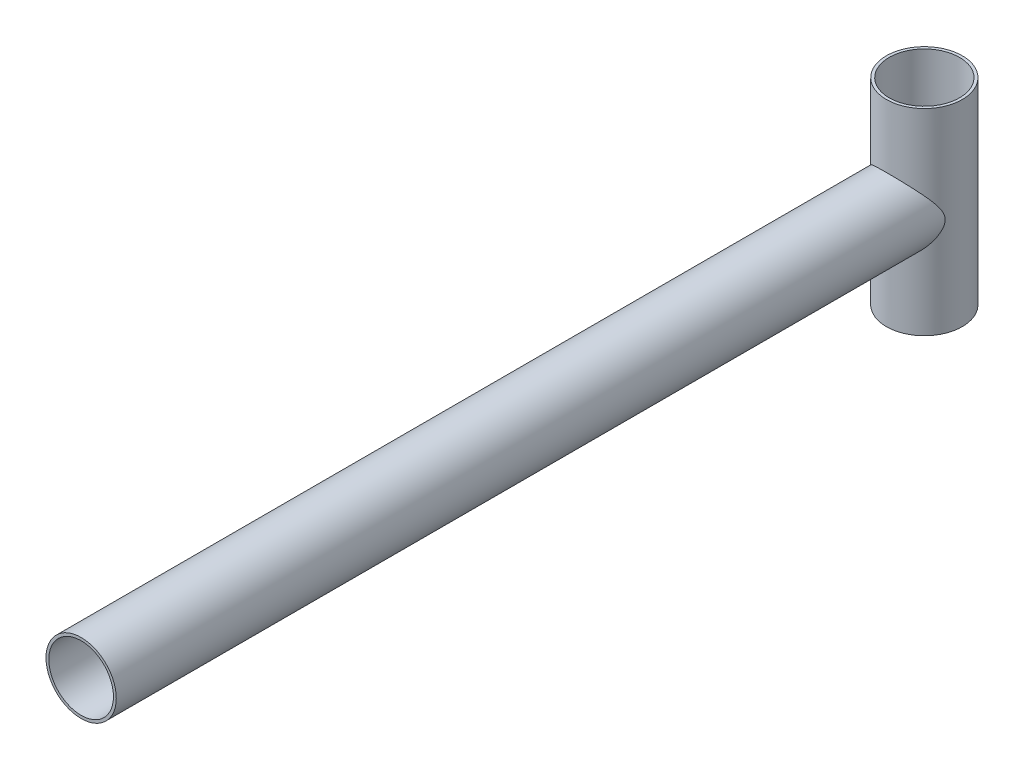
ISO-10303-21;
HEADER;
FILE_DESCRIPTION(('STEP AP214'),'2;1');
FILE_NAME('part.step','',(''),(''),'','','');
FILE_SCHEMA(('AUTOMOTIVE_DESIGN { 1 0 10303 214 1 1 1 1 }'));
ENDSEC;
DATA;
#1=APPLICATION_CONTEXT('core data for automotive mechanical design processes');
#2=APPLICATION_PROTOCOL_DEFINITION('international standard','automotive_design',2000,#1);
#3=PRODUCT_CONTEXT('',#1,'mechanical');
#4=PRODUCT('Part','Part','',(#3));
#5=PRODUCT_RELATED_PRODUCT_CATEGORY('part','',(#4));
#6=PRODUCT_DEFINITION_FORMATION('','',#4);
#7=PRODUCT_DEFINITION_CONTEXT('part definition',#1,'design');
#8=PRODUCT_DEFINITION('design','',#6,#7);
#9=PRODUCT_DEFINITION_SHAPE('','',#8);
#10=(LENGTH_UNIT() NAMED_UNIT(*) SI_UNIT(.MILLI.,.METRE.));
#11=(NAMED_UNIT(*) PLANE_ANGLE_UNIT() SI_UNIT($,.RADIAN.));
#12=(NAMED_UNIT(*) SI_UNIT($,.STERADIAN.) SOLID_ANGLE_UNIT());
#13=UNCERTAINTY_MEASURE_WITH_UNIT(LENGTH_MEASURE(1.E-05),#10,'distance_accuracy_value','');
#14=(GEOMETRIC_REPRESENTATION_CONTEXT(3) GLOBAL_UNCERTAINTY_ASSIGNED_CONTEXT((#13)) GLOBAL_UNIT_ASSIGNED_CONTEXT((#10,
#11,#12)) REPRESENTATION_CONTEXT('',''));
#15=CARTESIAN_POINT('',(0.,0.,0.));
#16=DIRECTION('',(0.,0.,1.));
#17=DIRECTION('',(1.,0.,0.));
#18=AXIS2_PLACEMENT_3D('',#15,#16,#17);
#19=CARTESIAN_POINT('',(0.,35.,0.));
#20=DIRECTION('',(0.,-1.,0.));
#21=DIRECTION('',(0.,0.,-1.));
#22=AXIS2_PLACEMENT_3D('',#19,#20,#21);
#23=CYLINDRICAL_SURFACE('',#22,13.5);
#24=CARTESIAN_POINT('',(0.,35.,0.));
#25=DIRECTION('',(0.,1.,0.));
#26=DIRECTION('',(0.,0.,1.));
#27=AXIS2_PLACEMENT_3D('',#24,#25,#26);
#28=CIRCLE('',#27,13.5);
#29=CARTESIAN_POINT('',(0.,35.,13.5));
#30=VERTEX_POINT('',#29);
#31=EDGE_CURVE('E41',#30,#30,#28,.T.);
#32=ORIENTED_EDGE('',*,*,#31,.F.);
#33=EDGE_LOOP('',(#32));
#34=FACE_BOUND('',#33,.T.);
#35=CARTESIAN_POINT('',(0.,-35.,0.));
#36=DIRECTION('',(0.,1.,0.));
#37=DIRECTION('',(0.,0.,1.));
#38=AXIS2_PLACEMENT_3D('',#35,#36,#37);
#39=CIRCLE('',#38,13.5);
#40=CARTESIAN_POINT('',(0.,-35.,13.5));
#41=VERTEX_POINT('',#40);
#42=EDGE_CURVE('E45',#41,#41,#39,.T.);
#43=ORIENTED_EDGE('',*,*,#42,.T.);
#44=EDGE_LOOP('',(#43));
#45=FACE_BOUND('',#44,.T.);
#46=CARTESIAN_POINT('',(-12.5,0.,5.09901951359278));
#47=CARTESIAN_POINT('',(-12.4999980153661,-0.171195739511042,5.09902766777696));
#48=CARTESIAN_POINT('',(-12.4964677234357,-0.342475989978951,5.10770534306377));
#49=CARTESIAN_POINT('',(-12.482484900301,-0.683158412139467,5.14177882846587));
#50=CARTESIAN_POINT('',(-12.4720258298574,-0.852558655811287,5.16719043158399));
#51=CARTESIAN_POINT('',(-12.444511336363,-1.18856266162003,5.23310646501161));
#52=CARTESIAN_POINT('',(-12.4274278439932,-1.35515133305615,5.27367509232845));
#53=CARTESIAN_POINT('',(-12.38715952836,-1.68396919389914,5.36757735075688));
#54=CARTESIAN_POINT('',(-12.3639709667379,-1.84619564484517,5.42091880132123));
#55=CARTESIAN_POINT('',(-12.2982817050272,-2.25021778657923,5.56882154382599));
#56=CARTESIAN_POINT('',(-12.2520449498664,-2.48886821588845,5.67028740549554));
#57=CARTESIAN_POINT('',(-12.1479085024809,-2.95560344340862,5.89008765559115));
#58=CARTESIAN_POINT('',(-12.0899994640286,-3.18367959342151,6.00843553944686));
#59=CARTESIAN_POINT('',(-11.9632716169582,-3.63102147577967,6.25696908355778));
#60=CARTESIAN_POINT('',(-11.8944202078475,-3.85025834567505,6.38718960529778));
#61=CARTESIAN_POINT('',(-11.7465133364499,-4.28031735092628,6.65528949755655));
#62=CARTESIAN_POINT('',(-11.6674599682605,-4.49114120157924,6.7931672930113));
#63=CARTESIAN_POINT('',(-11.5044795772759,-4.89296233189367,7.06545141537953));
#64=CARTESIAN_POINT('',(-11.4211293232534,-5.08439033236111,7.19956989122054));
#65=CARTESIAN_POINT('',(-11.2457772424784,-5.46128872310491,7.4705135019963));
#66=CARTESIAN_POINT('',(-11.1537742126215,-5.64675828007975,7.60733901122932));
#67=CARTESIAN_POINT('',(-10.8647276159604,-6.19505406597116,8.01999653977496));
#68=CARTESIAN_POINT('',(-10.6547146029709,-6.54960058958076,8.2978935238081));
#69=CARTESIAN_POINT('',(-10.2001085210487,-7.23721750031258,8.85076100138681));
#70=CARTESIAN_POINT('',(-9.95555805668294,-7.57031362187798,9.12573465830994));
#71=CARTESIAN_POINT('',(-9.43089029150658,-8.21466723271007,9.66696659856982));
#72=CARTESIAN_POINT('',(-9.15079298860344,-8.52593684942058,9.93322967717262));
#73=CARTESIAN_POINT('',(-8.63097268102672,-9.04735783741291,10.3847212100218));
#74=CARTESIAN_POINT('',(-8.39942690645402,-9.26290723240262,10.573160412335));
#75=CARTESIAN_POINT('',(-7.91590597729258,-9.67937121800385,10.9398568770643));
#76=CARTESIAN_POINT('',(-7.66393095580943,-9.88028590395082,11.1181142058069));
#77=CARTESIAN_POINT('',(-7.13986466855235,-10.2653745551155,11.461691711848));
#78=CARTESIAN_POINT('',(-6.86780233348845,-10.4495717764494,11.627029815451));
#79=CARTESIAN_POINT('',(-6.3035306280357,-10.7993337964389,11.9423568554927));
#80=CARTESIAN_POINT('',(-6.01132585384088,-10.9649028232134,12.092349274302));
#81=CARTESIAN_POINT('',(-5.46924230106502,-11.2432342414448,12.3453505755766));
#82=CARTESIAN_POINT('',(-5.22290761505925,-11.3598753692854,12.4516986450795));
#83=CARTESIAN_POINT('',(-4.71870555755988,-11.5783967439471,12.6513754204859));
#84=CARTESIAN_POINT('',(-4.46084076996544,-11.6802802764677,12.7447070242633));
#85=CARTESIAN_POINT('',(-3.93465912034715,-11.8678742504716,12.916851416443));
#86=CARTESIAN_POINT('',(-3.66634548353044,-11.9535896355215,12.9956686425806));
#87=CARTESIAN_POINT('',(-3.12061254005726,-12.1075242369907,13.1373985479734));
#88=CARTESIAN_POINT('',(-2.84319313466375,-12.1757432636201,13.2003110547039));
#89=CARTESIAN_POINT('',(-2.27911534295112,-12.2938697224964,13.3093468015743));
#90=CARTESIAN_POINT('',(-1.99240589989755,-12.3436457120741,13.3553495086279));
#91=CARTESIAN_POINT('',(-1.41387044941108,-12.4232128176673,13.4289235155226));
#92=CARTESIAN_POINT('',(-1.12204442720692,-12.4530038759778,13.4564947621441));
#93=CARTESIAN_POINT('',(-0.535951444440154,-12.4919565317164,13.4925506708853));
#94=CARTESIAN_POINT('',(-0.241685462082728,-12.501126029865,13.5010426428298));
#95=CARTESIAN_POINT('',(0.346668381859068,-12.498653540959,13.4987532562118));
#96=CARTESIAN_POINT('',(0.640756256765499,-12.4870133731087,13.4879735823981));
#97=CARTESIAN_POINT('',(1.1935594563605,-12.4456225917525,13.4496643000956));
#98=CARTESIAN_POINT('',(1.45257961669995,-12.4180243138584,13.4241255089941));
#99=CARTESIAN_POINT('',(1.9665580164033,-12.3470619538639,13.3585087499393));
#100=CARTESIAN_POINT('',(2.22151661907957,-12.3036992902712,13.3184320901303));
#101=CARTESIAN_POINT('',(2.72580727384063,-12.2018916291037,13.2244386346563));
#102=CARTESIAN_POINT('',(2.97513892976353,-12.1434455731715,13.1705208678028));
#103=CARTESIAN_POINT('',(3.46681514949667,-12.0123244961524,13.0497237466566));
#104=CARTESIAN_POINT('',(3.70915930806055,-11.9396486516926,12.9828436423313));
#105=CARTESIAN_POINT('',(4.1950071563081,-11.7779449839743,12.834287227603));
#106=CARTESIAN_POINT('',(4.43819050543388,-11.6883918122719,12.752137238656));
#107=CARTESIAN_POINT('',(4.91496292006698,-11.4960538575987,12.5760786680992));
#108=CARTESIAN_POINT('',(5.14854824135467,-11.3932639743891,12.4821655544218));
#109=CARTESIAN_POINT('',(5.60536824074998,-11.1755924509715,12.2838046526183));
#110=CARTESIAN_POINT('',(5.82860264257494,-11.0607104882739,12.1793565835334));
#111=CARTESIAN_POINT('',(6.26430493722003,-10.8199107615154,11.9610988031811));
#112=CARTESIAN_POINT('',(6.47677051565773,-10.6939906409265,11.8472870931975));
#113=CARTESIAN_POINT('',(6.99924978663592,-10.3633921270673,11.5495601351507));
#114=CARTESIAN_POINT('',(7.30197422271688,-10.1520473397054,11.3601867482934));
#115=CARTESIAN_POINT('',(7.8814936497697,-9.7090277434718,10.9660826097507));
#116=CARTESIAN_POINT('',(8.15827693293423,-9.47734384560182,10.7613449982028));
#117=CARTESIAN_POINT('',(8.68672920978941,-8.99549483475712,10.339502584476));
#118=CARTESIAN_POINT('',(8.93833103934785,-8.74528323945787,10.1223670133622));
#119=CARTESIAN_POINT('',(9.41601739788693,-8.22875262244213,9.67959989550397));
#120=CARTESIAN_POINT('',(9.64210627126303,-7.96243635495853,9.45396980397576));
#121=CARTESIAN_POINT('',(10.0747150807093,-7.40789326053409,8.99181603504389));
#122=CARTESIAN_POINT('',(10.2806047546048,-7.11928519157332,8.75516103346484));
#123=CARTESIAN_POINT('',(10.6667961326355,-6.52646125622434,8.28028425123013));
#124=CARTESIAN_POINT('',(10.8470888458862,-6.22223995655033,8.04206195065446));
#125=CARTESIAN_POINT('',(11.1818858130527,-5.59826239930425,7.56960920554904));
#126=CARTESIAN_POINT('',(11.3364496908278,-5.27854434026834,7.33537069382336));
#127=CARTESIAN_POINT('',(11.6199816162101,-4.62106481798175,6.87737928471841));
#128=CARTESIAN_POINT('',(11.7489704092599,-4.28331826331849,6.65361800213149));
#129=CARTESIAN_POINT('',(11.9644918609724,-3.63338886712094,6.25656585730195));
#130=CARTESIAN_POINT('',(12.0544204877831,-3.32404737917383,6.08056103862066));
#131=CARTESIAN_POINT('',(12.1729711569034,-2.84529225093215,5.83755125252709));
#132=CARTESIAN_POINT('',(12.2097635341184,-2.68325479762008,5.76004943844908));
#133=CARTESIAN_POINT('',(12.2775056330976,-2.35397149404437,5.61420432874979));
#134=CARTESIAN_POINT('',(12.3084562484352,-2.18672644491702,5.54585963289301));
#135=CARTESIAN_POINT('',(12.3819610532545,-1.73697191994864,5.38049726820296));
#136=CARTESIAN_POINT('',(12.4191405796,-1.44963379322108,5.29338237791489));
#137=CARTESIAN_POINT('',(12.4599740918363,-1.01029475909684,5.19617898661264));
#138=CARTESIAN_POINT('',(12.4710925567784,-0.86260053194682,5.16936541399027));
#139=CARTESIAN_POINT('',(12.4881006931937,-0.565220310029039,5.12814265254168));
#140=CARTESIAN_POINT('',(12.4939931287528,-0.415535410717136,5.1137269065351));
#141=CARTESIAN_POINT('',(12.5003928558197,-0.114248062110222,5.09806379417873));
#142=CARTESIAN_POINT('',(12.5008601131191,0.0373603877520366,5.09691432449906));
#143=CARTESIAN_POINT('',(12.4962918663034,0.339989473545557,5.10810370563037));
#144=CARTESIAN_POINT('',(12.4912562606543,0.491010098579197,5.12044280532051));
#145=CARTESIAN_POINT('',(12.4758282767199,0.791444506928094,5.15791745669999));
#146=CARTESIAN_POINT('',(12.4654257280714,0.940854687698213,5.18307730259939));
#147=CARTESIAN_POINT('',(12.4395455676429,1.23685162359784,5.24488533592758));
#148=CARTESIAN_POINT('',(12.424065807063,1.38343715540813,5.28153838727169));
#149=CARTESIAN_POINT('',(12.3808706733484,1.73407595861257,5.3822076418321));
#150=CARTESIAN_POINT('',(12.3507472228133,1.93638671510993,5.45124965757059));
#151=CARTESIAN_POINT('',(12.2819011591811,2.33358211011606,5.6046371768574));
#152=CARTESIAN_POINT('',(12.2431734578323,2.52846227420525,5.68899173027985));
#153=CARTESIAN_POINT('',(12.157744878314,2.9116833796243,5.8693465786588));
#154=CARTESIAN_POINT('',(12.1110184576583,3.10000097090592,5.96538388693301));
#155=CARTESIAN_POINT('',(12.0102037119271,3.47013152883293,6.16584198240814));
#156=CARTESIAN_POINT('',(11.9561124946344,3.65194190443923,6.27026605652172));
#157=CARTESIAN_POINT('',(11.838929424304,4.01591459614132,6.4888874387332));
#158=CARTESIAN_POINT('',(11.7755892354576,4.19786751831694,6.60329868935121));
#159=CARTESIAN_POINT('',(11.6416821814692,4.55606870468893,6.836619442234));
#160=CARTESIAN_POINT('',(11.5711162112526,4.73231767178003,6.95552838630418));
#161=CARTESIAN_POINT('',(11.3486546731148,5.25367664784072,7.31696025510593));
#162=CARTESIAN_POINT('',(11.1860798682437,5.59113967124189,7.5640270881608));
#163=CARTESIAN_POINT('',(10.8325876894661,6.24855115464507,8.06217782349988));
#164=CARTESIAN_POINT('',(10.6416281374675,6.56847256353483,8.31326719901918));
#165=CARTESIAN_POINT('',(10.231243960728,7.19100454938068,8.81341404324752));
#166=CARTESIAN_POINT('',(10.0118290689277,7.49362099460788,9.06247217590962));
#167=CARTESIAN_POINT('',(9.52686200084465,8.10254178273178,9.57190907578624));
#168=CARTESIAN_POINT('',(9.25911670049354,8.40751873430379,9.83179692504219));
#169=CARTESIAN_POINT('',(8.68915162015267,8.99534494584227,10.3389656869814));
#170=CARTESIAN_POINT('',(8.38692099907241,9.2781871999918,10.586242599641));
#171=CARTESIAN_POINT('',(7.74854861076339,9.81753542345334,11.0620049527883));
#172=CARTESIAN_POINT('',(7.41252792104077,10.0741292160631,11.2905525116002));
#173=CARTESIAN_POINT('',(6.70584240493802,10.557681653809,11.7240432861727));
#174=CARTESIAN_POINT('',(6.33520532864232,10.7846636930765,11.9290051200462));
#175=CARTESIAN_POINT('',(5.71138345881586,11.1221617733708,12.2351790386471));
#176=CARTESIAN_POINT('',(5.46862260608334,11.2436261887614,12.3457257124759));
#177=CARTESIAN_POINT('',(4.97126714172943,11.4721987376021,12.554248225025));
#178=CARTESIAN_POINT('',(4.71667627851811,11.5793113772831,12.6522280091352));
#179=CARTESIAN_POINT('',(4.19665004417018,11.7777563731574,12.8340940850413));
#180=CARTESIAN_POINT('',(3.93121924465327,11.8690952984674,12.9179862433621));
#181=CARTESIAN_POINT('',(3.39069871286916,12.0346600011192,13.0702710553195));
#182=CARTESIAN_POINT('',(3.1156086463562,12.1088851855895,13.1386631719868));
#183=CARTESIAN_POINT('',(2.55541757446597,12.2394097423059,13.2590538856224));
#184=CARTESIAN_POINT('',(2.27025748775284,12.2955721928426,13.3109272368025));
#185=CARTESIAN_POINT('',(1.69403103252682,12.3881150626761,13.3964578191756));
#186=CARTESIAN_POINT('',(1.40296468670529,12.4244955579586,13.4301151203395));
#187=CARTESIAN_POINT('',(0.81753773104799,12.4766965639737,13.4784219843147));
#188=CARTESIAN_POINT('',(0.523178502439684,12.4925253915103,13.4930792360207));
#189=CARTESIAN_POINT('',(-0.066236447137882,12.5032983389029,13.503053893782));
#190=CARTESIAN_POINT('',(-0.361292102847768,12.4982443435685,13.4983730452257));
#191=CARTESIAN_POINT('',(-0.91751901963276,12.4690472160119,13.471344172972));
#192=CARTESIAN_POINT('',(-1.17890252416526,12.4470285355268,13.4509623882346));
#193=CARTESIAN_POINT('',(-1.69817957727843,12.386867626441,13.395311069798));
#194=CARTESIAN_POINT('',(-1.9560734243448,12.3487267859517,13.3600428178179));
#195=CARTESIAN_POINT('',(-2.46670300538124,12.2569442812488,13.2752542270941));
#196=CARTESIAN_POINT('',(-2.7194384592699,12.2033017777375,13.2257331166666));
#197=CARTESIAN_POINT('',(-3.21828616665063,12.0813317642345,13.1132764749623));
#198=CARTESIAN_POINT('',(-3.46439808001102,12.0130035017135,13.0503402562683));
#199=CARTESIAN_POINT('',(-3.95444574302441,11.8608481295784,12.9104145715119));
#200=CARTESIAN_POINT('',(-4.19819616703888,11.776696082213,12.8331310110832));
#201=CARTESIAN_POINT('',(-4.67656794334988,11.5950510070415,12.6666447135018));
#202=CARTESIAN_POINT('',(-4.91118574966827,11.4975528623347,12.5774374050882));
#203=CARTESIAN_POINT('',(-5.37048157508483,11.2903236742044,12.3882854369227));
#204=CARTESIAN_POINT('',(-5.59515882572795,11.1805916873433,12.2883399490959));
#205=CARTESIAN_POINT('',(-6.03408509478663,10.9499457179636,12.0788651809295));
#206=CARTESIAN_POINT('',(-6.24833188069106,10.8290293574899,11.9693338627753));
#207=CARTESIAN_POINT('',(-6.77211806990137,10.5130230241861,11.6840470570103));
#208=CARTESIAN_POINT('',(-7.07483337929415,10.3114344954586,11.5028949341663));
#209=CARTESIAN_POINT('',(-7.65541271513066,9.88806673813606,11.1249606884251));
#210=CARTESIAN_POINT('',(-7.93326594018011,9.66627881748993,10.9281718415399));
#211=CARTESIAN_POINT('',(-8.46471047202249,9.20450203927671,10.5219183684595));
#212=CARTESIAN_POINT('',(-8.71824873482769,8.96447534839851,10.3124275865876));
#213=CARTESIAN_POINT('',(-9.20073555848144,8.46853936198403,9.88435438248356));
#214=CARTESIAN_POINT('',(-9.42968768603775,8.212632378722,9.6657732853823));
#215=CARTESIAN_POINT('',(-9.86878270443938,7.67979063078056,9.21726395233866));
#216=CARTESIAN_POINT('',(-10.0783403272438,7.40249802511947,8.98718923222079));
#217=CARTESIAN_POINT('',(-10.472823110104,6.83300974226122,8.52422651163547));
#218=CARTESIAN_POINT('',(-10.6577421557869,6.54081039055409,8.29133782842885));
#219=CARTESIAN_POINT('',(-11.0030169683922,5.94163785718453,7.82733191627579));
#220=CARTESIAN_POINT('',(-11.163403762952,5.63468399364611,7.59621280682284));
#221=CARTESIAN_POINT('',(-11.4598537923223,5.00431114098649,7.14109420222049));
#222=CARTESIAN_POINT('',(-11.5959307037586,4.68090154221295,6.91709076252535));
#223=CARTESIAN_POINT('',(-11.7821247510153,4.17897678065151,6.59147635966763));
#224=CARTESIAN_POINT('',(-11.8415333463577,4.00768121448056,6.48399698665619));
#225=CARTESIAN_POINT('',(-11.9537155977646,3.65952999174784,6.27476971412588));
#226=CARTESIAN_POINT('',(-12.0064907355381,3.48267558793051,6.17302053747139));
#227=CARTESIAN_POINT('',(-12.1050682235214,3.12283155412656,5.97740021931434));
#228=CARTESIAN_POINT('',(-12.150874156497,2.93984513596332,5.88352504111885));
#229=CARTESIAN_POINT('',(-12.2350302690708,2.56721082123899,5.70645620921323));
#230=CARTESIAN_POINT('',(-12.2733829912505,2.37756522254359,5.62325891615949));
#231=CARTESIAN_POINT('',(-12.3583957699747,1.89842726144357,5.43463726368268));
#232=CARTESIAN_POINT('',(-12.4002686763065,1.60452498020382,5.33758765916404));
#233=CARTESIAN_POINT('',(-12.4475115998059,1.15421416351824,5.22600198267297));
#234=CARTESIAN_POINT('',(-12.4606573247644,1.00275129763329,5.19449184370419));
#235=CARTESIAN_POINT('',(-12.4814669235366,0.697377544374364,5.14429135518693));
#236=CARTESIAN_POINT('',(-12.4891351184665,0.543468684805029,5.12559090080805));
#237=CARTESIAN_POINT('',(-12.4959605997529,0.324300903482819,5.10891279664166));
#238=CARTESIAN_POINT('',(-12.4974741616373,0.259507725108932,5.10520794008901));
#239=CARTESIAN_POINT('',(-12.4994942303783,0.129813746850292,5.10025977132022));
#240=CARTESIAN_POINT('',(-12.5000007525213,0.0649129486141355,5.09901642173932));
#241=CARTESIAN_POINT('',(-12.5,0.,5.09901951359278));
#242=B_SPLINE_CURVE_WITH_KNOTS('',3,(#46,#47,#48,#49,#50,#51,#52,#53,#54,#55,#56,#57,#58,#59,
#60,#61,#62,#63,#64,#65,#66,#67,#68,#69,#70,#71,#72,#73,#74,#75,#76,#77,#78,#79,#80,#81,#82,#83,
#84,#85,#86,#87,#88,#89,#90,#91,#92,#93,#94,#95,#96,#97,#98,#99,#100,#101,#102,#103,#104,#105,
#106,#107,#108,#109,#110,#111,#112,#113,#114,#115,#116,#117,#118,#119,#120,#121,#122,#123,#124,
#125,#126,#127,#128,#129,#130,#131,#132,#133,#134,#135,#136,#137,#138,#139,#140,#141,#142,#143,
#144,#145,#146,#147,#148,#149,#150,#151,#152,#153,#154,#155,#156,#157,#158,#159,#160,#161,#162,
#163,#164,#165,#166,#167,#168,#169,#170,#171,#172,#173,#174,#175,#176,#177,#178,#179,#180,#181,
#182,#183,#184,#185,#186,#187,#188,#189,#190,#191,#192,#193,#194,#195,#196,#197,#198,#199,#200,
#201,#202,#203,#204,#205,#206,#207,#208,#209,#210,#211,#212,#213,#214,#215,#216,#217,#218,#219,
#220,#221,#222,#223,#224,#225,#226,#227,#228,#229,#230,#231,#232,#233,#234,#235,#236,#237,#238,
#239,#240,#241),.UNSPECIFIED.,.T.,.F.,(4,2,2,2,2,2,2,2,2,2,2,2,2,2,2,2,2,2,2,2,2,2,2,2,2,2,2,2,
2,2,2,2,2,2,2,2,2,2,2,2,2,2,2,2,2,2,2,2,2,2,2,2,2,2,2,2,2,2,2,2,2,2,2,2,2,2,2,2,2,2,2,2,2,2,2,2,
2,2,2,2,2,2,2,2,2,2,2,2,2,2,2,2,2,2,2,2,2,4),(0.,0.513488930736137,1.02746317353039,
1.54363947914039,2.06013259662196,2.84894894778303,3.63839944700548,4.43024762980456,
5.2219335322393,5.96613165818458,6.71043341277789,8.19967779763054,9.687100877517,
11.1736908432734,12.2774637132674,13.3812293922694,14.4834352717081,15.5853904720311,
16.4622861972408,17.3389863852251,18.2154180776257,19.091859276624,19.9744318690869,
20.8570070099067,21.7392439528339,22.6214037733916,23.4057010777342,24.1899278270496,
24.9742096182216,25.758536803422,26.5733179106003,27.3884139058333,28.2035316447775,
29.0188238283922,30.2617621871533,31.5052588366656,32.7519883866156,33.9985053196723,
35.2761744031294,36.5542911610107,37.8294034914558,39.1034772339479,40.2029188774936,
40.7526089473616,41.3022148667251,42.2059814232685,42.6570292416249,43.1078383549189,
43.5619720435444,44.0161141115849,44.4711199577079,44.9263186224143,45.572848121728,
46.2197609783928,46.8687795461788,47.518053728099,48.1899996675687,48.8618624858161,
50.2065346532218,51.5532252786456,52.8994564873141,54.3434278957482,55.7878545001748,
57.2272783032245,58.6655579434763,59.5441137207937,60.4223929957876,61.3003056161213,
62.1782486454191,63.0626979651983,63.9471438876412,64.8312317827713,65.7152398850021,
66.5036053716116,67.2919029941005,68.0802433049392,68.8686240216384,69.6754322484458,
70.4825506769024,71.2897313910488,72.0970841193849,73.3141980839521,74.5318382850234,
75.7520771084143,76.9721386720781,78.2215623276067,79.4712954681266,80.7194346767234,
81.9668694614281,82.5989736826273,83.2309364594646,83.8625732477272,84.4939941802696,
85.4271245799114,85.892398684684,86.3573053372385,86.5520098704828,86.7467114481623),.UNSPECIFIED.);
#243=CARTESIAN_POINT('',(-12.5,0.,5.09901951359278));
#244=VERTEX_POINT('',#243);
#245=EDGE_CURVE('E10',#244,#244,#242,.T.);
#246=ORIENTED_EDGE('',*,*,#245,.F.);
#247=EDGE_LOOP('',(#246));
#248=FACE_BOUND('',#247,.T.);
#249=ADVANCED_FACE('F31',(#34,#45,#248),#23,.T.);
#250=CARTESIAN_POINT('',(0.,35.,0.));
#251=DIRECTION('',(0.,1.,0.));
#252=DIRECTION('',(0.,0.,1.));
#253=AXIS2_PLACEMENT_3D('',#250,#251,#252);
#254=PLANE('',#253);
#255=CARTESIAN_POINT('',(0.,35.,0.));
#256=DIRECTION('',(0.,1.,0.));
#257=DIRECTION('',(0.,0.,1.));
#258=AXIS2_PLACEMENT_3D('',#255,#256,#257);
#259=CIRCLE('',#258,12.5);
#260=CARTESIAN_POINT('',(0.,35.,12.5));
#261=VERTEX_POINT('',#260);
#262=EDGE_CURVE('E61',#261,#261,#259,.T.);
#263=ORIENTED_EDGE('',*,*,#262,.F.);
#264=EDGE_LOOP('',(#263));
#265=FACE_BOUND('',#264,.T.);
#266=ORIENTED_EDGE('',*,*,#31,.T.);
#267=EDGE_LOOP('',(#266));
#268=FACE_BOUND('',#267,.T.);
#269=ADVANCED_FACE('F85',(#265,#268),#254,.T.);
#270=CARTESIAN_POINT('',(0.,-35.,0.));
#271=DIRECTION('',(0.,1.,0.));
#272=DIRECTION('',(0.,0.,1.));
#273=AXIS2_PLACEMENT_3D('',#270,#271,#272);
#274=PLANE('',#273);
#275=CARTESIAN_POINT('',(0.,-35.,0.));
#276=DIRECTION('',(0.,1.,0.));
#277=DIRECTION('',(0.,0.,1.));
#278=AXIS2_PLACEMENT_3D('',#275,#276,#277);
#279=CIRCLE('',#278,12.5);
#280=CARTESIAN_POINT('',(0.,-35.,12.5));
#281=VERTEX_POINT('',#280);
#282=EDGE_CURVE('E58',#281,#281,#279,.T.);
#283=ORIENTED_EDGE('',*,*,#282,.T.);
#284=EDGE_LOOP('',(#283));
#285=FACE_BOUND('',#284,.T.);
#286=ORIENTED_EDGE('',*,*,#42,.F.);
#287=EDGE_LOOP('',(#286));
#288=FACE_BOUND('',#287,.T.);
#289=ADVANCED_FACE('F83',(#285,#288),#274,.F.);
#290=CARTESIAN_POINT('',(0.,0.,300.));
#291=DIRECTION('',(0.,0.,-1.));
#292=DIRECTION('',(-1.,0.,0.));
#293=AXIS2_PLACEMENT_3D('',#290,#291,#292);
#294=CYLINDRICAL_SURFACE('',#293,12.5);
#295=CARTESIAN_POINT('',(0.,0.,300.));
#296=DIRECTION('',(0.,0.,1.));
#297=DIRECTION('',(1.,0.,0.));
#298=AXIS2_PLACEMENT_3D('',#295,#296,#297);
#299=CIRCLE('',#298,12.5);
#300=CARTESIAN_POINT('',(12.5,0.,300.));
#301=VERTEX_POINT('',#300);
#302=EDGE_CURVE('E50',#301,#301,#299,.T.);
#303=ORIENTED_EDGE('',*,*,#302,.F.);
#304=EDGE_LOOP('',(#303));
#305=FACE_BOUND('',#304,.T.);
#306=ORIENTED_EDGE('',*,*,#245,.T.);
#307=EDGE_LOOP('',(#306));
#308=FACE_BOUND('',#307,.T.);
#309=ADVANCED_FACE('F78',(#305,#308),#294,.T.);
#310=CARTESIAN_POINT('',(0.,0.,300.));
#311=DIRECTION('',(0.,0.,1.));
#312=DIRECTION('',(1.,0.,0.));
#313=AXIS2_PLACEMENT_3D('',#310,#311,#312);
#314=PLANE('',#313);
#315=CARTESIAN_POINT('',(0.,0.,300.));
#316=DIRECTION('',(0.,0.,1.));
#317=DIRECTION('',(1.,0.,0.));
#318=AXIS2_PLACEMENT_3D('',#315,#316,#317);
#319=CIRCLE('',#318,11.5);
#320=CARTESIAN_POINT('',(11.5,0.,300.));
#321=VERTEX_POINT('',#320);
#322=EDGE_CURVE('E55',#321,#321,#319,.T.);
#323=ORIENTED_EDGE('',*,*,#322,.F.);
#324=EDGE_LOOP('',(#323));
#325=FACE_BOUND('',#324,.T.);
#326=ORIENTED_EDGE('',*,*,#302,.T.);
#327=EDGE_LOOP('',(#326));
#328=FACE_BOUND('',#327,.T.);
#329=ADVANCED_FACE('F76',(#325,#328),#314,.T.);
#330=CARTESIAN_POINT('',(0.,35.,0.));
#331=DIRECTION('',(0.,-1.,0.));
#332=DIRECTION('',(0.,0.,-1.));
#333=AXIS2_PLACEMENT_3D('',#330,#331,#332);
#334=CYLINDRICAL_SURFACE('',#333,12.5);
#335=ORIENTED_EDGE('',*,*,#262,.T.);
#336=EDGE_LOOP('',(#335));
#337=FACE_BOUND('',#336,.T.);
#338=ORIENTED_EDGE('',*,*,#282,.F.);
#339=EDGE_LOOP('',(#338));
#340=FACE_BOUND('',#339,.T.);
#341=CARTESIAN_POINT('',(11.4972003460974,-0.253740421887631,4.90554626944853));
#342=CARTESIAN_POINT('',(11.5005227674154,-0.103240333173163,4.8977588968966));
#343=CARTESIAN_POINT('',(11.5008874887245,0.0476767965099789,4.89690018396966));
#344=CARTESIAN_POINT('',(11.4956943458477,0.348837927282426,4.90907880843502));
#345=CARTESIAN_POINT('',(11.4901366393127,0.499081946182561,4.92211577593406));
#346=CARTESIAN_POINT('',(11.4732649167729,0.797910423267988,4.96131424224349));
#347=CARTESIAN_POINT('',(11.4619350912925,0.946489172037067,4.98751178428862));
#348=CARTESIAN_POINT('',(11.4338419789501,1.24060761858963,5.05158142107714));
#349=CARTESIAN_POINT('',(11.4170760761413,1.38614581723727,5.08945913611764));
#350=CARTESIAN_POINT('',(11.370412589902,1.73379844399424,5.19308611247282));
#351=CARTESIAN_POINT('',(11.3379562936402,1.93406586561293,5.26386360654347));
#352=CARTESIAN_POINT('',(11.2639166931869,2.32684220333772,5.42048651462367));
#353=CARTESIAN_POINT('',(11.2223277391979,2.51934622907829,5.50634124935396));
#354=CARTESIAN_POINT('',(11.1306769125547,2.8975886448423,5.6893357366641));
#355=CARTESIAN_POINT('',(11.0805869864616,3.08330207595495,5.7865125081509));
#356=CARTESIAN_POINT('',(10.9725671156237,3.44803730974005,5.98881738979535));
#357=CARTESIAN_POINT('',(10.9146341312104,3.62705648347416,6.09394857577565));
#358=CARTESIAN_POINT('',(10.7921473794303,3.97660336772689,6.30829474312309));
#359=CARTESIAN_POINT('',(10.7276959677992,4.14721414908956,6.41743338417473));
#360=CARTESIAN_POINT('',(10.5917203963372,4.48310947699639,6.63946080690894));
#361=CARTESIAN_POINT('',(10.5201949621632,4.64839305674034,6.75235026183713));
#362=CARTESIAN_POINT('',(10.295090328309,5.13712110646441,7.09475765077356));
#363=CARTESIAN_POINT('',(10.1310439898428,5.45326996528295,7.32790512393101));
#364=CARTESIAN_POINT('',(9.77531268708594,6.06788292329116,7.7961473686685));
#365=CARTESIAN_POINT('',(9.5836311719288,6.36634922288348,8.03124189379163));
#366=CARTESIAN_POINT('',(9.1722479372012,6.94593829312384,8.49803512823611));
#367=CARTESIAN_POINT('',(8.95255914520966,7.22706897726258,8.7297353496302));
#368=CARTESIAN_POINT('',(8.51719980559318,7.73321340376296,9.15348546912524));
#369=CARTESIAN_POINT('',(8.30525370445258,7.96058076441989,9.3465533656931));
#370=CARTESIAN_POINT('',(7.85969087877293,8.40079346331427,9.72422445334076));
#371=CARTESIAN_POINT('',(7.62607240925795,8.61363762980115,9.90882696102864));
#372=CARTESIAN_POINT('',(7.13734043497865,9.02273505577899,10.266446058593));
#373=CARTESIAN_POINT('',(6.88226468042801,9.21901628425818,10.4394820731438));
#374=CARTESIAN_POINT('',(6.35032711891098,9.59317429330934,10.7713291871668));
#375=CARTESIAN_POINT('',(6.07347345795734,9.77105789841037,10.9301455584048));
#376=CARTESIAN_POINT('',(5.56713941558897,10.065837921793,11.1945491655388));
#377=CARTESIAN_POINT('',(5.3421309138281,10.1871550602355,11.3037917673278));
#378=CARTESIAN_POINT('',(4.88035029214753,10.4162640258859,11.5106965688097));
#379=CARTESIAN_POINT('',(4.64358504986749,10.5240636336407,11.6083654284287));
#380=CARTESIAN_POINT('',(4.15898483977144,10.7248131213952,11.7906679571057));
#381=CARTESIAN_POINT('',(3.9111506694687,10.8177640690354,11.8753025633299));
#382=CARTESIAN_POINT('',(3.40554215991206,10.9874189396053,12.0300526116158));
#383=CARTESIAN_POINT('',(3.1477676783382,11.0641226298136,12.1001678457053));
#384=CARTESIAN_POINT('',(2.62167429785587,11.2005027668508,12.2249949285358));
#385=CARTESIAN_POINT('',(2.35328576542701,11.2600329742306,12.2795744346105));
#386=CARTESIAN_POINT('',(1.81002692151074,11.3600206833295,12.3713246863326));
#387=CARTESIAN_POINT('',(1.53515659036889,11.4004781272074,12.4084953791849));
#388=CARTESIAN_POINT('',(0.981518644693949,11.461419121128,12.4645089788262));
#389=CARTESIAN_POINT('',(0.702753495566155,11.4819147732526,12.4833629903113));
#390=CARTESIAN_POINT('',(0.143849221839131,11.5024987247015,12.5022981745483));
#391=CARTESIAN_POINT('',(-0.136289735101084,11.5025894551617,12.5023815837159));
#392=CARTESIAN_POINT('',(-0.659505259573253,11.4836666828696,12.4849746223864));
#393=CARTESIAN_POINT('',(-0.90275113186852,11.4670886828015,12.4697246456014));
#394=CARTESIAN_POINT('',(-1.38640957138334,11.4187091682098,12.4252496118157));
#395=CARTESIAN_POINT('',(-1.62682242696511,11.3869092170282,12.3960259899523));
#396=CARTESIAN_POINT('',(-2.10319848182618,11.3086177438488,12.3241468256751));
#397=CARTESIAN_POINT('',(-2.33916150302179,11.2621256351833,12.2814907468945));
#398=CARTESIAN_POINT('',(-2.80520846031042,11.1551770054389,12.1834935711322));
#399=CARTESIAN_POINT('',(-3.03529210202439,11.0947197866462,12.128151840361));
#400=CARTESIAN_POINT('',(-3.49076952525567,10.9599968515972,12.0050312466481));
#401=CARTESIAN_POINT('',(-3.71608810331012,10.8855920317427,11.9371271940683));
#402=CARTESIAN_POINT('',(-4.15860225083137,10.7243420690792,11.7902673498324));
#403=CARTESIAN_POINT('',(-4.37579467982204,10.6374921780461,11.7113073402112));
#404=CARTESIAN_POINT('',(-4.80125334884122,10.4523582125755,11.5434080844261));
#405=CARTESIAN_POINT('',(-5.00951933332356,10.3540738110897,11.4544685528318));
#406=CARTESIAN_POINT('',(-5.41664420304128,10.1470264989427,11.2676597348722));
#407=CARTESIAN_POINT('',(-5.61550108749331,10.0382613744225,11.169788562095));
#408=CARTESIAN_POINT('',(-6.09905938473759,9.75520525844309,10.9159692243907));
#409=CARTESIAN_POINT('',(-6.37779513186219,9.57502826379602,10.7551609292812));
#410=CARTESIAN_POINT('',(-6.91308396106721,9.1960274606031,10.4191757309696));
#411=CARTESIAN_POINT('',(-7.16962767296582,8.99719584863622,10.2439928185927));
#412=CARTESIAN_POINT('',(-7.6610202375649,8.58267568284244,9.88190797995117));
#413=CARTESIAN_POINT('',(-7.8958194583896,8.36695054318622,9.6949808026721));
#414=CARTESIAN_POINT('',(-8.34332795641145,7.92077769733424,9.31265164449844));
#415=CARTESIAN_POINT('',(-8.55604022605652,7.69033199240374,9.11725081675416));
#416=CARTESIAN_POINT('',(-8.96460721689735,7.21023739873271,8.7160595030041));
#417=CARTESIAN_POINT('',(-9.15994482084704,6.96026341439168,8.51013261669241));
#418=CARTESIAN_POINT('',(-9.52843504955608,6.44661757396555,8.09542241214536));
#419=CARTESIAN_POINT('',(-9.70158277527578,6.18294271102358,7.88663847435785));
#420=CARTESIAN_POINT('',(-10.0256486780597,5.64229891168815,7.47032540732013));
#421=CARTESIAN_POINT('',(-10.1766089242036,5.36535648959962,7.26279463793929));
#422=CARTESIAN_POINT('',(-10.4566410879275,4.79677881287337,6.85347236104019));
#423=CARTESIAN_POINT('',(-10.5857240724959,4.50515108448332,6.65167799492249));
#424=CARTESIAN_POINT('',(-10.819600967944,3.90984070231133,6.26389720006581));
#425=CARTESIAN_POINT('',(-10.9247721499978,3.60644910048011,6.07769960879364));
#426=CARTESIAN_POINT('',(-11.0652319829199,3.13644560222505,5.81554692607474));
#427=CARTESIAN_POINT('',(-11.109182682989,2.97722761240007,5.73099074894742));
#428=CARTESIAN_POINT('',(-11.1909467646578,2.65342302587514,5.56963873094879));
#429=CARTESIAN_POINT('',(-11.2287608056814,2.48883700829034,5.49284205660362));
#430=CARTESIAN_POINT('',(-11.3209848853697,2.04128431239716,5.30121947584442));
#431=CARTESIAN_POINT('',(-11.369526508854,1.75292427105907,5.195412783856));
#432=CARTESIAN_POINT('',(-11.4261571909546,1.30960775615358,5.06903355140316));
#433=CARTESIAN_POINT('',(-11.4423271967752,1.16022876622039,5.03232083486139));
#434=CARTESIAN_POINT('',(-11.4689114558649,0.858469687881463,4.97143563322738));
#435=CARTESIAN_POINT('',(-11.4793294788749,0.70609163299565,4.94725493552529));
#436=CARTESIAN_POINT('',(-11.4941841662178,0.397391400837126,4.91264725543237));
#437=CARTESIAN_POINT('',(-11.4985388437873,0.241043732571985,4.90240883626205));
#438=CARTESIAN_POINT('',(-11.5008396237776,-0.0719576420243467,4.89700900897993));
#439=CARTESIAN_POINT('',(-11.4987860276232,-0.228611333614801,4.90184689172713));
#440=CARTESIAN_POINT('',(-11.4883410776353,-0.540795933231034,4.92627538181884));
#441=CARTESIAN_POINT('',(-11.4799389564343,-0.696324480027111,4.94589105275262));
#442=CARTESIAN_POINT('',(-11.457079528373,-1.00461145032227,4.99861411623984));
#443=CARTESIAN_POINT('',(-11.4426207488602,-1.15736919067994,5.03172478999709));
#444=CARTESIAN_POINT('',(-11.4039775836321,-1.49484351650379,5.11879448173863));
#445=CARTESIAN_POINT('',(-11.3783028577502,-1.67858894580025,5.17583028441526));
#446=CARTESIAN_POINT('',(-11.3191382909005,-2.03976624699716,5.30396767657737));
#447=CARTESIAN_POINT('',(-11.2856453893543,-2.21719561492095,5.3750747728828));
#448=CARTESIAN_POINT('',(-11.2114139437575,-2.56635136621191,5.52824221915109));
#449=CARTESIAN_POINT('',(-11.1706519245155,-2.73805706667887,5.61033783498857));
#450=CARTESIAN_POINT('',(-11.0824561297028,-3.0756493191553,5.78260655846584));
#451=CARTESIAN_POINT('',(-11.0350194411418,-3.24153329071348,5.87278318658567));
#452=CARTESIAN_POINT('',(-10.9332204887856,-3.56995985741061,6.06021459435925));
#453=CARTESIAN_POINT('',(-10.8787797678388,-3.73243567659617,6.15754317129807));
#454=CARTESIAN_POINT('',(-10.7636778574645,-4.05242321320168,6.35660993472016));
#455=CARTESIAN_POINT('',(-10.7030153953773,-4.20993390635444,6.45834902090793));
#456=CARTESIAN_POINT('',(-10.5118554413739,-4.67587725061366,6.76828451365761));
#457=CARTESIAN_POINT('',(-10.3722404247877,-4.97754578387027,6.98109545273156));
#458=CARTESIAN_POINT('',(-10.0690353013205,-5.56542564797035,7.41175858533171));
#459=CARTESIAN_POINT('',(-9.90541145384092,-5.85161443687621,7.62961750409128));
#460=CARTESIAN_POINT('',(-9.55423525146758,-6.40897894768119,8.06503604751125));
#461=CARTESIAN_POINT('',(-9.36669099853513,-6.68015970848599,8.28259574841508));
#462=CARTESIAN_POINT('',(-8.94979636759013,-7.23052399696557,8.73230805981732));
#463=CARTESIAN_POINT('',(-8.71822696443315,-7.50834512981637,8.96407993997703));
#464=CARTESIAN_POINT('',(-8.22551611306217,-8.04509727092233,9.41823685019538));
#465=CARTESIAN_POINT('',(-7.96436627232821,-8.30402288373354,9.64061919157684));
#466=CARTESIAN_POINT('',(-7.41277911674982,-8.79987728034506,10.0708850771035));
#467=CARTESIAN_POINT('',(-7.12242848317785,-9.0368673787565,10.2788086050486));
#468=CARTESIAN_POINT('',(-6.51172981439003,-9.48635393207068,10.6761365798843));
#469=CARTESIAN_POINT('',(-6.19140109573404,-9.6988659652727,10.8655527933978));
#470=CARTESIAN_POINT('',(-5.63970049061723,-10.0253293033128,11.1581365682339));
#471=CARTESIAN_POINT('',(-5.41682980313394,-10.147596465019,11.2681513957166));
#472=CARTESIAN_POINT('',(-4.95927029363509,-10.3788875691056,11.4768820578855));
#473=CARTESIAN_POINT('',(-4.72458496767348,-10.4879153969134,11.5756012070897));
#474=CARTESIAN_POINT('',(-4.24417906553727,-10.6913497398244,11.7602354342368));
#475=CARTESIAN_POINT('',(-3.99846236688333,-10.7857613414123,11.8461549660853));
#476=CARTESIAN_POINT('',(-3.49699970845959,-10.9586183525803,12.003751706195));
#477=CARTESIAN_POINT('',(-3.24125345774831,-11.0370632985837,12.0754285009303));
#478=CARTESIAN_POINT('',(-2.71907051494453,-11.1772236113348,12.2036683285102));
#479=CARTESIAN_POINT('',(-2.45256258147244,-11.2387943570605,12.2601006525152));
#480=CARTESIAN_POINT('',(-1.91283893986416,-11.3431291561777,12.3558143123559));
#481=CARTESIAN_POINT('',(-1.63962324007665,-11.3858932329752,12.395095669537));
#482=CARTESIAN_POINT('',(-1.08899046505469,-11.4516781632573,12.4555515509726));
#483=CARTESIAN_POINT('',(-0.811575901413066,-11.4747103788113,12.4767364955461));
#484=CARTESIAN_POINT('',(-0.255024713844794,-11.5005450742488,12.500500403951));
#485=CARTESIAN_POINT('',(0.0241117077896242,-11.5033498868888,12.5030815132984));
#486=CARTESIAN_POINT('',(0.547359010129591,-11.4895743954349,12.4904089630736));
#487=CARTESIAN_POINT('',(0.791588732647873,-11.4753171069684,12.4772925240345));
#488=CARTESIAN_POINT('',(1.27746331001675,-11.4314291405277,12.4369408305617));
#489=CARTESIAN_POINT('',(1.51910841294805,-11.4017999517643,12.4097069438094));
#490=CARTESIAN_POINT('',(1.99815343884663,-11.3276714252828,12.3416338094137));
#491=CARTESIAN_POINT('',(2.23555324271383,-11.2831716710644,12.300794180696));
#492=CARTESIAN_POINT('',(2.70463455275927,-11.1800103062567,12.2062363319198));
#493=CARTESIAN_POINT('',(2.93631579736745,-11.1213480491849,12.1525175239601));
#494=CARTESIAN_POINT('',(3.39362826556213,-10.9904544356839,12.0328460068912));
#495=CARTESIAN_POINT('',(3.61923137149322,-10.918169392585,11.9668449073158));
#496=CARTESIAN_POINT('',(4.06249809450282,-10.7611071734429,11.8237211310616));
#497=CARTESIAN_POINT('',(4.28015864777555,-10.6763252390193,11.746594218301));
#498=CARTESIAN_POINT('',(4.70671748384856,-10.4952608471578,11.5822732509392));
#499=CARTESIAN_POINT('',(4.91561520384042,-10.3989776525546,11.4950785510622));
#500=CARTESIAN_POINT('',(5.32413416861013,-10.1958647308802,11.3116645921257));
#501=CARTESIAN_POINT('',(5.52375344546857,-10.0890327813382,11.2154434315351));
#502=CARTESIAN_POINT('',(6.00777487716342,-9.81161237946985,10.9664207557944));
#503=CARTESIAN_POINT('',(6.2863932228428,-9.63521255112683,10.8087938595963));
#504=CARTESIAN_POINT('',(6.82186690372611,-9.2638222528876,10.4790786625035));
#505=CARTESIAN_POINT('',(7.07871320903504,-9.06882413996879,10.3069844196831));
#506=CARTESIAN_POINT('',(7.57102585607788,-8.66208519140014,9.95098057269844));
#507=CARTESIAN_POINT('',(7.80644906257054,-8.45031211514535,9.76704835024615));
#508=CARTESIAN_POINT('',(8.25556512365202,-8.01212088482228,9.39050108299339));
#509=CARTESIAN_POINT('',(8.46926072168665,-7.78570458560814,9.19788713883801));
#510=CARTESIAN_POINT('',(8.88004831999971,-7.31401486538513,8.80215501487682));
#511=CARTESIAN_POINT('',(9.07664301826807,-7.06842674890527,8.59889698442119));
#512=CARTESIAN_POINT('',(9.44801456438588,-6.56378002246154,8.18910651326927));
#513=CARTESIAN_POINT('',(9.62278736725199,-6.30471892766822,7.98257347347823));
#514=CARTESIAN_POINT('',(9.95060765966697,-5.77345176149791,7.56998924919756));
#515=CARTESIAN_POINT('',(10.1036803665695,-5.50126144887662,7.36393778366351));
#516=CARTESIAN_POINT('',(10.388391265953,-4.94263629829975,6.95650216546778));
#517=CARTESIAN_POINT('',(10.5200381908926,-4.65620732601362,6.75511614017016));
#518=CARTESIAN_POINT('',(10.709451572246,-4.19408720774812,6.44785650698779));
#519=CARTESIAN_POINT('',(10.774601380923,-4.02389005531153,6.33823512625653));
#520=CARTESIAN_POINT('',(10.8976374328118,-3.67767243546122,6.12427123633862));
#521=CARTESIAN_POINT('',(10.9555251137125,-3.50165312941052,6.01992768474501));
#522=CARTESIAN_POINT('',(11.0637546755577,-3.14299265025486,5.81862448848143));
#523=CARTESIAN_POINT('',(11.1140929413292,-2.96034835631425,5.72166839229049));
#524=CARTESIAN_POINT('',(11.2066547234958,-2.58800488224249,5.53818168357712));
#525=CARTESIAN_POINT('',(11.2488800467264,-2.39830728421282,5.45164875131468));
#526=CARTESIAN_POINT('',(11.346958111942,-1.89605186312997,5.24558387633645));
#527=CARTESIAN_POINT('',(11.3960625778664,-1.57729124711985,5.13687614749226));
#528=CARTESIAN_POINT('',(11.44964356434,-1.08745330746758,5.01573933108741));
#529=CARTESIAN_POINT('',(11.4641483914024,-0.922582672283252,4.98237424969521));
#530=CARTESIAN_POINT('',(11.4860675548721,-0.589894785016692,4.93163543415884));
#531=CARTESIAN_POINT('',(11.4934841359124,-0.422078482892477,4.91425663770753));
#532=CARTESIAN_POINT('',(11.4972003460974,-0.253740421887631,4.90554626944853));
#533=B_SPLINE_CURVE_WITH_KNOTS('',3,(#341,#342,#343,#344,#345,#346,#347,#348,#349,#350,#351,
#352,#353,#354,#355,#356,#357,#358,#359,#360,#361,#362,#363,#364,#365,#366,#367,#368,#369,#370,
#371,#372,#373,#374,#375,#376,#377,#378,#379,#380,#381,#382,#383,#384,#385,#386,#387,#388,#389,
#390,#391,#392,#393,#394,#395,#396,#397,#398,#399,#400,#401,#402,#403,#404,#405,#406,#407,#408,
#409,#410,#411,#412,#413,#414,#415,#416,#417,#418,#419,#420,#421,#422,#423,#424,#425,#426,#427,
#428,#429,#430,#431,#432,#433,#434,#435,#436,#437,#438,#439,#440,#441,#442,#443,#444,#445,#446,
#447,#448,#449,#450,#451,#452,#453,#454,#455,#456,#457,#458,#459,#460,#461,#462,#463,#464,#465,
#466,#467,#468,#469,#470,#471,#472,#473,#474,#475,#476,#477,#478,#479,#480,#481,#482,#483,#484,
#485,#486,#487,#488,#489,#490,#491,#492,#493,#494,#495,#496,#497,#498,#499,#500,#501,#502,#503,
#504,#505,#506,#507,#508,#509,#510,#511,#512,#513,#514,#515,#516,#517,#518,#519,#520,#521,#522,
#523,#524,#525,#526,#527,#528,#529,#530,#531,#532),.UNSPECIFIED.,.T.,.F.,(4,2,2,2,2,2,2,2,2,2,2,
2,2,2,2,2,2,2,2,2,2,2,2,2,2,2,2,2,2,2,2,2,2,2,2,2,2,2,2,2,2,2,2,2,2,2,2,2,2,2,2,2,2,2,2,2,2,2,2,
2,2,2,2,2,2,2,2,2,2,2,2,2,2,2,2,2,2,2,2,2,2,2,2,2,2,2,2,2,2,2,2,2,2,2,2,4),(0.,
0.452008334257676,0.904004636671084,1.35724563836995,1.81070507301436,2.45417521017865,
3.09804454870636,3.74408152830989,4.39036960768273,5.02774235762898,5.66523013635407,
6.94084447363302,8.21629973968327,9.49116839921586,10.5879750488726,11.6848700859655,
12.7798741538426,13.8744705661519,14.7077171311143,15.5404818649668,16.3731866948354,
17.2059034513481,18.0455148837836,18.8851288624595,19.7242334973775,20.5632381574723,
21.2952174914659,22.0271216650238,22.7590550677066,23.4910250465862,24.2307262444937,
24.9707104191133,25.7107157638636,26.4508777651433,27.555637588442,28.660861622461,
29.7685491724122,30.8760864510906,32.0097948257247,33.143753068742,34.2755327111877,
35.406738103434,36.5186184838945,37.0749870190298,37.6312957291075,38.5605435970498,
39.024035155445,39.4872225885478,39.9566142101088,40.4259837533231,40.8961511591136,
41.3664329506738,41.9477650425773,42.5293250911198,43.1127984356379,43.6965272167187,
44.2874814320438,44.8785567692881,46.0613385138201,47.2457986792576,48.429858722197,
49.7171151723613,51.0047377602548,52.2886450008307,53.5717305705702,54.4020074229594,
55.2320400170348,56.061783105136,56.8915502806041,57.7282211546347,58.5648909873737,
59.4010787215209,60.2371700194838,60.9712680947602,61.7052950647889,62.4393425954323,
63.1734236398263,63.9104605604685,64.6477788475052,65.3851444178285,66.1226656732941,
67.217532502687,68.3128512257336,69.4103287009671,70.5076674301981,71.6303434427279,
72.753227250459,73.8747952832428,74.995905050061,75.6336957952916,76.2713600766857,
76.9093287467005,77.547155169446,78.5628772459115,79.068619922158,79.5742023918889),.UNSPECIFIED.);
#534=CARTESIAN_POINT('',(11.4972003460974,-0.253740421887631,4.90554626944853));
#535=VERTEX_POINT('',#534);
#536=EDGE_CURVE('E54',#535,#535,#533,.T.);
#537=ORIENTED_EDGE('',*,*,#536,.T.);
#538=EDGE_LOOP('',(#537));
#539=FACE_BOUND('',#538,.T.);
#540=ADVANCED_FACE('F69',(#337,#340,#539),#334,.F.);
#541=CARTESIAN_POINT('',(0.,0.,300.));
#542=DIRECTION('',(0.,0.,-1.));
#543=DIRECTION('',(-1.,0.,0.));
#544=AXIS2_PLACEMENT_3D('',#541,#542,#543);
#545=CYLINDRICAL_SURFACE('',#544,11.5);
#546=ORIENTED_EDGE('',*,*,#322,.T.);
#547=EDGE_LOOP('',(#546));
#548=FACE_BOUND('',#547,.T.);
#549=ORIENTED_EDGE('',*,*,#536,.F.);
#550=EDGE_LOOP('',(#549));
#551=FACE_BOUND('',#550,.T.);
#552=ADVANCED_FACE('F71',(#548,#551),#545,.F.);
#553=CLOSED_SHELL('',(#249,#269,#289,#309,#329,#540,#552));
#554=MANIFOLD_SOLID_BREP('B2',#553);
#555=ADVANCED_BREP_SHAPE_REPRESENTATION('',(#18,#554),#14);
#556=SHAPE_DEFINITION_REPRESENTATION(#9,#555);
ENDSEC;
END-ISO-10303-21;
